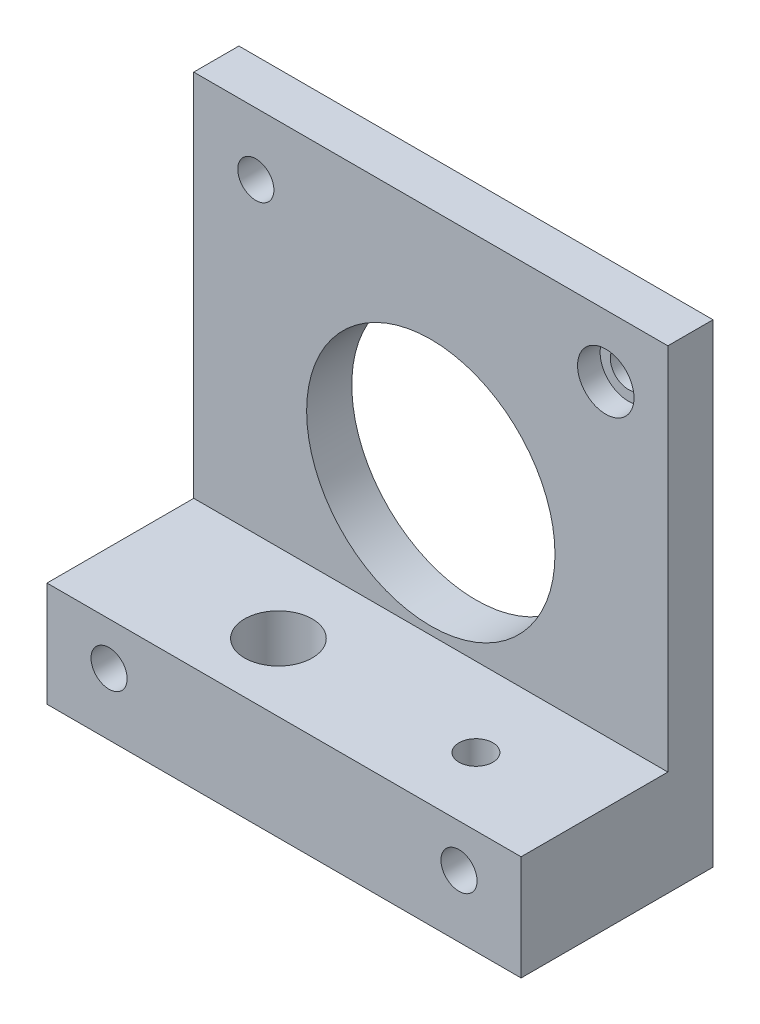
ISO-10303-21;
HEADER;
FILE_DESCRIPTION(('STEP AP214'),'2;1');
FILE_NAME('part.step','',(''),(''),'','','');
FILE_SCHEMA(('AUTOMOTIVE_DESIGN { 1 0 10303 214 1 1 1 1 }'));
ENDSEC;
DATA;
#1=APPLICATION_CONTEXT('core data for automotive mechanical design processes');
#2=APPLICATION_PROTOCOL_DEFINITION('international standard','automotive_design',2000,#1);
#3=PRODUCT_CONTEXT('',#1,'mechanical');
#4=PRODUCT('Part','Part','',(#3));
#5=PRODUCT_RELATED_PRODUCT_CATEGORY('part','',(#4));
#6=PRODUCT_DEFINITION_FORMATION('','',#4);
#7=PRODUCT_DEFINITION_CONTEXT('part definition',#1,'design');
#8=PRODUCT_DEFINITION('design','',#6,#7);
#9=PRODUCT_DEFINITION_SHAPE('','',#8);
#10=(LENGTH_UNIT() NAMED_UNIT(*) SI_UNIT(.MILLI.,.METRE.));
#11=(NAMED_UNIT(*) PLANE_ANGLE_UNIT() SI_UNIT($,.RADIAN.));
#12=(NAMED_UNIT(*) SI_UNIT($,.STERADIAN.) SOLID_ANGLE_UNIT());
#13=UNCERTAINTY_MEASURE_WITH_UNIT(LENGTH_MEASURE(1.E-05),#10,'distance_accuracy_value','');
#14=(GEOMETRIC_REPRESENTATION_CONTEXT(3) GLOBAL_UNCERTAINTY_ASSIGNED_CONTEXT((#13)) GLOBAL_UNIT_ASSIGNED_CONTEXT((#10,
#11,#12)) REPRESENTATION_CONTEXT('',''));
#15=CARTESIAN_POINT('',(0.,0.,0.));
#16=DIRECTION('',(0.,0.,1.));
#17=DIRECTION('',(1.,0.,0.));
#18=AXIS2_PLACEMENT_3D('',#15,#16,#17);
#19=CARTESIAN_POINT('',(36.5,36.5,0.));
#20=DIRECTION('',(0.,0.,1.));
#21=DIRECTION('',(1.,0.,0.));
#22=AXIS2_PLACEMENT_3D('',#19,#20,#21);
#23=CYLINDRICAL_SURFACE('',#22,1.6);
#24=CARTESIAN_POINT('',(36.5,36.5,0.));
#25=DIRECTION('',(0.,0.,1.));
#26=DIRECTION('',(1.,0.,0.));
#27=AXIS2_PLACEMENT_3D('',#24,#25,#26);
#28=CIRCLE('',#27,1.6);
#29=CARTESIAN_POINT('',(38.1,36.5,0.));
#30=VERTEX_POINT('',#29);
#31=EDGE_CURVE('E183',#30,#30,#28,.T.);
#32=ORIENTED_EDGE('',*,*,#31,.F.);
#33=EDGE_LOOP('',(#32));
#34=FACE_BOUND('',#33,.T.);
#35=CARTESIAN_POINT('',(36.5,36.5,2.));
#36=DIRECTION('',(0.,0.,1.));
#37=DIRECTION('',(1.,0.,0.));
#38=AXIS2_PLACEMENT_3D('',#35,#36,#37);
#39=CIRCLE('',#38,1.6);
#40=CARTESIAN_POINT('',(38.1,36.5,2.));
#41=VERTEX_POINT('',#40);
#42=EDGE_CURVE('E47',#41,#41,#39,.F.);
#43=ORIENTED_EDGE('',*,*,#42,.F.);
#44=EDGE_LOOP('',(#43));
#45=FACE_BOUND('',#44,.T.);
#46=ADVANCED_FACE('F43',(#34,#45),#23,.F.);
#47=CARTESIAN_POINT('',(0.,0.,17.));
#48=DIRECTION('',(1.,0.,0.));
#49=DIRECTION('',(0.,0.,-1.));
#50=AXIS2_PLACEMENT_3D('',#47,#48,#49);
#51=PLANE('',#50);
#52=DIRECTION('',(0.,0.,1.));
#53=VECTOR('',#52,1.);
#54=CARTESIAN_POINT('',(0.,9.3,17.));
#55=LINE('',#54,#53);
#56=CARTESIAN_POINT('',(0.,9.3,4.));
#57=VERTEX_POINT('',#56);
#58=CARTESIAN_POINT('',(0.,9.3,17.));
#59=VERTEX_POINT('',#58);
#60=EDGE_CURVE('E61',#57,#59,#55,.T.);
#61=ORIENTED_EDGE('',*,*,#60,.F.);
#62=DIRECTION('',(0.,1.,0.));
#63=VECTOR('',#62,1.);
#64=CARTESIAN_POINT('',(0.,9.3,4.));
#65=LINE('',#64,#63);
#66=CARTESIAN_POINT('',(0.,42.,4.));
#67=VERTEX_POINT('',#66);
#68=EDGE_CURVE('E97',#57,#67,#65,.T.);
#69=ORIENTED_EDGE('',*,*,#68,.T.);
#70=DIRECTION('',(0.,0.,-1.));
#71=VECTOR('',#70,1.);
#72=CARTESIAN_POINT('',(0.,42.,17.));
#73=LINE('',#72,#71);
#74=CARTESIAN_POINT('',(0.,42.,0.));
#75=VERTEX_POINT('',#74);
#76=EDGE_CURVE('E90',#67,#75,#73,.T.);
#77=ORIENTED_EDGE('',*,*,#76,.T.);
#78=DIRECTION('',(0.,-1.,0.));
#79=VECTOR('',#78,1.);
#80=CARTESIAN_POINT('',(0.,0.,0.));
#81=LINE('',#80,#79);
#82=CARTESIAN_POINT('',(0.,0.,0.));
#83=VERTEX_POINT('',#82);
#84=EDGE_CURVE('E94',#75,#83,#81,.T.);
#85=ORIENTED_EDGE('',*,*,#84,.T.);
#86=DIRECTION('',(0.,0.,-1.));
#87=VECTOR('',#86,1.);
#88=CARTESIAN_POINT('',(0.,0.,17.));
#89=LINE('',#88,#87);
#90=CARTESIAN_POINT('',(0.,0.,17.));
#91=VERTEX_POINT('',#90);
#92=EDGE_CURVE('E11',#91,#83,#89,.T.);
#93=ORIENTED_EDGE('',*,*,#92,.F.);
#94=DIRECTION('',(0.,-1.,0.));
#95=VECTOR('',#94,1.);
#96=CARTESIAN_POINT('',(0.,0.,17.));
#97=LINE('',#96,#95);
#98=EDGE_CURVE('E112',#59,#91,#97,.T.);
#99=ORIENTED_EDGE('',*,*,#98,.F.);
#100=EDGE_LOOP('',(#61,#69,#77,#85,#93,#99));
#101=FACE_BOUND('',#100,.T.);
#102=ADVANCED_FACE('F45',(#101),#51,.F.);
#103=CARTESIAN_POINT('',(0.,0.,17.));
#104=DIRECTION('',(0.,1.,0.));
#105=DIRECTION('',(0.,0.,1.));
#106=AXIS2_PLACEMENT_3D('',#103,#104,#105);
#107=PLANE('',#106);
#108=CARTESIAN_POINT('',(32.,0.,11.));
#109=DIRECTION('',(0.,1.,0.));
#110=DIRECTION('',(0.,0.,1.));
#111=AXIS2_PLACEMENT_3D('',#108,#109,#110);
#112=CIRCLE('',#111,1.5);
#113=CARTESIAN_POINT('',(32.,0.,12.5));
#114=VERTEX_POINT('',#113);
#115=EDGE_CURVE('E211',#114,#114,#112,.T.);
#116=ORIENTED_EDGE('',*,*,#115,.T.);
#117=EDGE_LOOP('',(#116));
#118=FACE_BOUND('',#117,.T.);
#119=CARTESIAN_POINT('',(14.5,0.,11.));
#120=DIRECTION('',(0.,1.,0.));
#121=DIRECTION('',(0.,0.,1.));
#122=AXIS2_PLACEMENT_3D('',#119,#120,#121);
#123=CIRCLE('',#122,3.);
#124=CARTESIAN_POINT('',(14.5,0.,14.));
#125=VERTEX_POINT('',#124);
#126=EDGE_CURVE('E215',#125,#125,#123,.T.);
#127=ORIENTED_EDGE('',*,*,#126,.T.);
#128=EDGE_LOOP('',(#127));
#129=FACE_BOUND('',#128,.T.);
#130=DIRECTION('',(1.,0.,0.));
#131=VECTOR('',#130,1.);
#132=CARTESIAN_POINT('',(0.,0.,0.));
#133=LINE('',#132,#131);
#134=CARTESIAN_POINT('',(42.,0.,0.));
#135=VERTEX_POINT('',#134);
#136=EDGE_CURVE('E116',#83,#135,#133,.T.);
#137=ORIENTED_EDGE('',*,*,#136,.T.);
#138=DIRECTION('',(0.,0.,-1.));
#139=VECTOR('',#138,1.);
#140=CARTESIAN_POINT('',(42.,0.,17.));
#141=LINE('',#140,#139);
#142=CARTESIAN_POINT('',(42.,0.,17.));
#143=VERTEX_POINT('',#142);
#144=EDGE_CURVE('E53',#143,#135,#141,.T.);
#145=ORIENTED_EDGE('',*,*,#144,.F.);
#146=DIRECTION('',(1.,0.,0.));
#147=VECTOR('',#146,1.);
#148=CARTESIAN_POINT('',(0.,0.,17.));
#149=LINE('',#148,#147);
#150=EDGE_CURVE('E70',#91,#143,#149,.T.);
#151=ORIENTED_EDGE('',*,*,#150,.F.);
#152=ORIENTED_EDGE('',*,*,#92,.T.);
#153=EDGE_LOOP('',(#137,#145,#151,#152));
#154=FACE_BOUND('',#153,.T.);
#155=ADVANCED_FACE('F231',(#118,#129,#154),#107,.F.);
#156=CARTESIAN_POINT('',(42.,0.,17.));
#157=DIRECTION('',(-1.,0.,0.));
#158=DIRECTION('',(0.,0.,1.));
#159=AXIS2_PLACEMENT_3D('',#156,#157,#158);
#160=PLANE('',#159);
#161=DIRECTION('',(0.,0.,-1.));
#162=VECTOR('',#161,1.);
#163=CARTESIAN_POINT('',(42.,42.,17.));
#164=LINE('',#163,#162);
#165=CARTESIAN_POINT('',(42.,42.,4.));
#166=VERTEX_POINT('',#165);
#167=CARTESIAN_POINT('',(42.,42.,0.));
#168=VERTEX_POINT('',#167);
#169=EDGE_CURVE('E101',#166,#168,#164,.T.);
#170=ORIENTED_EDGE('',*,*,#169,.F.);
#171=DIRECTION('',(0.,1.,0.));
#172=VECTOR('',#171,1.);
#173=CARTESIAN_POINT('',(42.,9.3,4.));
#174=LINE('',#173,#172);
#175=CARTESIAN_POINT('',(42.,9.3,4.));
#176=VERTEX_POINT('',#175);
#177=EDGE_CURVE('E122',#176,#166,#174,.T.);
#178=ORIENTED_EDGE('',*,*,#177,.F.);
#179=DIRECTION('',(0.,0.,-1.));
#180=VECTOR('',#179,1.);
#181=CARTESIAN_POINT('',(42.,9.3,17.));
#182=LINE('',#181,#180);
#183=CARTESIAN_POINT('',(42.,9.3,17.));
#184=VERTEX_POINT('',#183);
#185=EDGE_CURVE('E172',#184,#176,#182,.T.);
#186=ORIENTED_EDGE('',*,*,#185,.F.);
#187=DIRECTION('',(0.,1.,0.));
#188=VECTOR('',#187,1.);
#189=CARTESIAN_POINT('',(42.,0.,17.));
#190=LINE('',#189,#188);
#191=EDGE_CURVE('E102',#143,#184,#190,.T.);
#192=ORIENTED_EDGE('',*,*,#191,.F.);
#193=ORIENTED_EDGE('',*,*,#144,.T.);
#194=DIRECTION('',(0.,1.,0.));
#195=VECTOR('',#194,1.);
#196=CARTESIAN_POINT('',(42.,0.,0.));
#197=LINE('',#196,#195);
#198=EDGE_CURVE('E113',#135,#168,#197,.T.);
#199=ORIENTED_EDGE('',*,*,#198,.T.);
#200=EDGE_LOOP('',(#170,#178,#186,#192,#193,#199));
#201=FACE_BOUND('',#200,.T.);
#202=ADVANCED_FACE('F169',(#201),#160,.F.);
#203=CARTESIAN_POINT('',(0.,42.,17.));
#204=DIRECTION('',(0.,-1.,0.));
#205=DIRECTION('',(0.,0.,-1.));
#206=AXIS2_PLACEMENT_3D('',#203,#204,#205);
#207=PLANE('',#206);
#208=ORIENTED_EDGE('',*,*,#76,.F.);
#209=DIRECTION('',(-1.,0.,0.));
#210=VECTOR('',#209,1.);
#211=CARTESIAN_POINT('',(0.,42.,4.));
#212=LINE('',#211,#210);
#213=EDGE_CURVE('E141',#166,#67,#212,.T.);
#214=ORIENTED_EDGE('',*,*,#213,.F.);
#215=ORIENTED_EDGE('',*,*,#169,.T.);
#216=DIRECTION('',(-1.,0.,0.));
#217=VECTOR('',#216,1.);
#218=CARTESIAN_POINT('',(0.,42.,0.));
#219=LINE('',#218,#217);
#220=EDGE_CURVE('E105',#168,#75,#219,.T.);
#221=ORIENTED_EDGE('',*,*,#220,.T.);
#222=EDGE_LOOP('',(#208,#214,#215,#221));
#223=FACE_BOUND('',#222,.T.);
#224=ADVANCED_FACE('F106',(#223),#207,.F.);
#225=CARTESIAN_POINT('',(0.,0.,17.));
#226=DIRECTION('',(0.,0.,-1.));
#227=DIRECTION('',(-1.,0.,0.));
#228=AXIS2_PLACEMENT_3D('',#225,#226,#227);
#229=PLANE('',#228);
#230=CARTESIAN_POINT('',(36.5,5.5,17.));
#231=DIRECTION('',(0.,0.,1.));
#232=DIRECTION('',(1.,0.,0.));
#233=AXIS2_PLACEMENT_3D('',#230,#231,#232);
#234=CIRCLE('',#233,1.6);
#235=CARTESIAN_POINT('',(38.1,5.5,17.));
#236=VERTEX_POINT('',#235);
#237=EDGE_CURVE('E188',#236,#236,#234,.T.);
#238=ORIENTED_EDGE('',*,*,#237,.F.);
#239=EDGE_LOOP('',(#238));
#240=FACE_BOUND('',#239,.T.);
#241=CARTESIAN_POINT('',(5.5,5.5,17.));
#242=DIRECTION('',(0.,0.,1.));
#243=DIRECTION('',(1.,0.,0.));
#244=AXIS2_PLACEMENT_3D('',#241,#242,#243);
#245=CIRCLE('',#244,1.6);
#246=CARTESIAN_POINT('',(7.1,5.5,17.));
#247=VERTEX_POINT('',#246);
#248=EDGE_CURVE('E196',#247,#247,#245,.T.);
#249=ORIENTED_EDGE('',*,*,#248,.F.);
#250=EDGE_LOOP('',(#249));
#251=FACE_BOUND('',#250,.T.);
#252=ORIENTED_EDGE('',*,*,#191,.T.);
#253=DIRECTION('',(1.,0.,0.));
#254=VECTOR('',#253,1.);
#255=CARTESIAN_POINT('',(0.,9.3,17.));
#256=LINE('',#255,#254);
#257=EDGE_CURVE('E150',#59,#184,#256,.T.);
#258=ORIENTED_EDGE('',*,*,#257,.F.);
#259=ORIENTED_EDGE('',*,*,#98,.T.);
#260=ORIENTED_EDGE('',*,*,#150,.T.);
#261=EDGE_LOOP('',(#252,#258,#259,#260));
#262=FACE_BOUND('',#261,.T.);
#263=ADVANCED_FACE('F163',(#240,#251,#262),#229,.F.);
#264=CARTESIAN_POINT('',(0.,0.,0.));
#265=DIRECTION('',(0.,0.,-1.));
#266=DIRECTION('',(-1.,0.,0.));
#267=AXIS2_PLACEMENT_3D('',#264,#265,#266);
#268=PLANE('',#267);
#269=ORIENTED_EDGE('',*,*,#31,.T.);
#270=EDGE_LOOP('',(#269));
#271=FACE_BOUND('',#270,.T.);
#272=CARTESIAN_POINT('',(36.5,5.5,0.));
#273=DIRECTION('',(0.,0.,1.));
#274=DIRECTION('',(1.,0.,0.));
#275=AXIS2_PLACEMENT_3D('',#272,#273,#274);
#276=CIRCLE('',#275,1.6);
#277=CARTESIAN_POINT('',(38.1,5.5,0.));
#278=VERTEX_POINT('',#277);
#279=EDGE_CURVE('E187',#278,#278,#276,.T.);
#280=ORIENTED_EDGE('',*,*,#279,.T.);
#281=EDGE_LOOP('',(#280));
#282=FACE_BOUND('',#281,.T.);
#283=CARTESIAN_POINT('',(5.5,5.5,0.));
#284=DIRECTION('',(0.,0.,1.));
#285=DIRECTION('',(1.,0.,0.));
#286=AXIS2_PLACEMENT_3D('',#283,#284,#285);
#287=CIRCLE('',#286,1.6);
#288=CARTESIAN_POINT('',(7.1,5.5,0.));
#289=VERTEX_POINT('',#288);
#290=EDGE_CURVE('E192',#289,#289,#287,.T.);
#291=ORIENTED_EDGE('',*,*,#290,.T.);
#292=EDGE_LOOP('',(#291));
#293=FACE_BOUND('',#292,.T.);
#294=CARTESIAN_POINT('',(21.,21.,0.));
#295=DIRECTION('',(0.,0.,1.));
#296=DIRECTION('',(1.,0.,0.));
#297=AXIS2_PLACEMENT_3D('',#294,#295,#296);
#298=CIRCLE('',#297,11.);
#299=CARTESIAN_POINT('',(32.,21.,0.));
#300=VERTEX_POINT('',#299);
#301=EDGE_CURVE('E182',#300,#300,#298,.T.);
#302=ORIENTED_EDGE('',*,*,#301,.T.);
#303=EDGE_LOOP('',(#302));
#304=FACE_BOUND('',#303,.T.);
#305=CARTESIAN_POINT('',(5.5,36.5,0.));
#306=DIRECTION('',(0.,0.,1.));
#307=DIRECTION('',(1.,0.,0.));
#308=AXIS2_PLACEMENT_3D('',#305,#306,#307);
#309=CIRCLE('',#308,1.6);
#310=CARTESIAN_POINT('',(7.1,36.5,0.));
#311=VERTEX_POINT('',#310);
#312=EDGE_CURVE('E138',#311,#311,#309,.T.);
#313=ORIENTED_EDGE('',*,*,#312,.T.);
#314=EDGE_LOOP('',(#313));
#315=FACE_BOUND('',#314,.T.);
#316=ORIENTED_EDGE('',*,*,#84,.F.);
#317=ORIENTED_EDGE('',*,*,#220,.F.);
#318=ORIENTED_EDGE('',*,*,#198,.F.);
#319=ORIENTED_EDGE('',*,*,#136,.F.);
#320=EDGE_LOOP('',(#316,#317,#318,#319));
#321=FACE_BOUND('',#320,.T.);
#322=ADVANCED_FACE('F115',(#271,#282,#293,#304,#315,#321),#268,.T.);
#323=CARTESIAN_POINT('',(0.,9.3,4.));
#324=DIRECTION('',(0.,0.,-1.));
#325=DIRECTION('',(-1.,0.,0.));
#326=AXIS2_PLACEMENT_3D('',#323,#324,#325);
#327=PLANE('',#326);
#328=CARTESIAN_POINT('',(36.5,36.5,4.));
#329=DIRECTION('',(0.,0.,1.));
#330=DIRECTION('',(1.,0.,0.));
#331=AXIS2_PLACEMENT_3D('',#328,#329,#330);
#332=CIRCLE('',#331,2.5);
#333=CARTESIAN_POINT('',(39.,36.5,4.));
#334=VERTEX_POINT('',#333);
#335=EDGE_CURVE('E206',#334,#334,#332,.T.);
#336=ORIENTED_EDGE('',*,*,#335,.F.);
#337=EDGE_LOOP('',(#336));
#338=FACE_BOUND('',#337,.T.);
#339=CARTESIAN_POINT('',(21.,21.,4.));
#340=DIRECTION('',(0.,0.,-1.));
#341=DIRECTION('',(-1.,0.,0.));
#342=AXIS2_PLACEMENT_3D('',#339,#340,#341);
#343=CIRCLE('',#342,11.);
#344=CARTESIAN_POINT('',(10.,21.,4.));
#345=VERTEX_POINT('',#344);
#346=EDGE_CURVE('E137',#345,#345,#343,.T.);
#347=ORIENTED_EDGE('',*,*,#346,.T.);
#348=EDGE_LOOP('',(#347));
#349=FACE_BOUND('',#348,.T.);
#350=CARTESIAN_POINT('',(5.5,36.5,4.));
#351=DIRECTION('',(0.,0.,-1.));
#352=DIRECTION('',(-1.,0.,0.));
#353=AXIS2_PLACEMENT_3D('',#350,#351,#352);
#354=CIRCLE('',#353,1.6);
#355=CARTESIAN_POINT('',(3.9,36.5,4.));
#356=VERTEX_POINT('',#355);
#357=EDGE_CURVE('E134',#356,#356,#354,.T.);
#358=ORIENTED_EDGE('',*,*,#357,.T.);
#359=EDGE_LOOP('',(#358));
#360=FACE_BOUND('',#359,.T.);
#361=ORIENTED_EDGE('',*,*,#213,.T.);
#362=ORIENTED_EDGE('',*,*,#68,.F.);
#363=DIRECTION('',(-1.,0.,0.));
#364=VECTOR('',#363,1.);
#365=CARTESIAN_POINT('',(0.,9.3,4.));
#366=LINE('',#365,#364);
#367=EDGE_CURVE('E153',#176,#57,#366,.T.);
#368=ORIENTED_EDGE('',*,*,#367,.F.);
#369=ORIENTED_EDGE('',*,*,#177,.T.);
#370=EDGE_LOOP('',(#361,#362,#368,#369));
#371=FACE_BOUND('',#370,.T.);
#372=ADVANCED_FACE('F245',(#338,#349,#360,#371),#327,.F.);
#373=CARTESIAN_POINT('',(0.,9.3,0.));
#374=DIRECTION('',(0.,-1.,0.));
#375=DIRECTION('',(0.,0.,-1.));
#376=AXIS2_PLACEMENT_3D('',#373,#374,#375);
#377=PLANE('',#376);
#378=CARTESIAN_POINT('',(32.,9.3,11.));
#379=DIRECTION('',(0.,1.,0.));
#380=DIRECTION('',(0.,0.,1.));
#381=AXIS2_PLACEMENT_3D('',#378,#379,#380);
#382=CIRCLE('',#381,1.5);
#383=CARTESIAN_POINT('',(32.,9.3,12.5));
#384=VERTEX_POINT('',#383);
#385=EDGE_CURVE('E223',#384,#384,#382,.T.);
#386=ORIENTED_EDGE('',*,*,#385,.F.);
#387=EDGE_LOOP('',(#386));
#388=FACE_BOUND('',#387,.T.);
#389=CARTESIAN_POINT('',(14.5,9.3,11.));
#390=DIRECTION('',(0.,1.,0.));
#391=DIRECTION('',(0.,0.,1.));
#392=AXIS2_PLACEMENT_3D('',#389,#390,#391);
#393=CIRCLE('',#392,3.);
#394=CARTESIAN_POINT('',(14.5,9.3,14.));
#395=VERTEX_POINT('',#394);
#396=EDGE_CURVE('E219',#395,#395,#393,.T.);
#397=ORIENTED_EDGE('',*,*,#396,.F.);
#398=EDGE_LOOP('',(#397));
#399=FACE_BOUND('',#398,.T.);
#400=ORIENTED_EDGE('',*,*,#60,.T.);
#401=ORIENTED_EDGE('',*,*,#257,.T.);
#402=ORIENTED_EDGE('',*,*,#185,.T.);
#403=ORIENTED_EDGE('',*,*,#367,.T.);
#404=EDGE_LOOP('',(#400,#401,#402,#403));
#405=FACE_BOUND('',#404,.T.);
#406=ADVANCED_FACE('F241',(#388,#399,#405),#377,.F.);
#407=CARTESIAN_POINT('',(5.5,36.5,0.));
#408=DIRECTION('',(0.,0.,1.));
#409=DIRECTION('',(1.,0.,0.));
#410=AXIS2_PLACEMENT_3D('',#407,#408,#409);
#411=CYLINDRICAL_SURFACE('',#410,1.6);
#412=ORIENTED_EDGE('',*,*,#312,.F.);
#413=EDGE_LOOP('',(#412));
#414=FACE_BOUND('',#413,.T.);
#415=ORIENTED_EDGE('',*,*,#357,.F.);
#416=EDGE_LOOP('',(#415));
#417=FACE_BOUND('',#416,.T.);
#418=ADVANCED_FACE('F244',(#414,#417),#411,.F.);
#419=CARTESIAN_POINT('',(21.,21.,0.));
#420=DIRECTION('',(0.,0.,1.));
#421=DIRECTION('',(1.,0.,0.));
#422=AXIS2_PLACEMENT_3D('',#419,#420,#421);
#423=CYLINDRICAL_SURFACE('',#422,11.);
#424=ORIENTED_EDGE('',*,*,#301,.F.);
#425=EDGE_LOOP('',(#424));
#426=FACE_BOUND('',#425,.T.);
#427=ORIENTED_EDGE('',*,*,#346,.F.);
#428=EDGE_LOOP('',(#427));
#429=FACE_BOUND('',#428,.T.);
#430=ADVANCED_FACE('F274',(#426,#429),#423,.F.);
#431=CARTESIAN_POINT('',(5.5,5.5,0.));
#432=DIRECTION('',(0.,0.,1.));
#433=DIRECTION('',(1.,0.,0.));
#434=AXIS2_PLACEMENT_3D('',#431,#432,#433);
#435=CYLINDRICAL_SURFACE('',#434,1.6);
#436=ORIENTED_EDGE('',*,*,#290,.F.);
#437=EDGE_LOOP('',(#436));
#438=FACE_BOUND('',#437,.T.);
#439=ORIENTED_EDGE('',*,*,#248,.T.);
#440=EDGE_LOOP('',(#439));
#441=FACE_BOUND('',#440,.T.);
#442=ADVANCED_FACE('F330',(#438,#441),#435,.F.);
#443=CARTESIAN_POINT('',(36.5,5.5,0.));
#444=DIRECTION('',(0.,0.,1.));
#445=DIRECTION('',(1.,0.,0.));
#446=AXIS2_PLACEMENT_3D('',#443,#444,#445);
#447=CYLINDRICAL_SURFACE('',#446,1.6);
#448=ORIENTED_EDGE('',*,*,#279,.F.);
#449=EDGE_LOOP('',(#448));
#450=FACE_BOUND('',#449,.T.);
#451=ORIENTED_EDGE('',*,*,#237,.T.);
#452=EDGE_LOOP('',(#451));
#453=FACE_BOUND('',#452,.T.);
#454=ADVANCED_FACE('F271',(#450,#453),#447,.F.);
#455=CARTESIAN_POINT('',(36.5,36.5,2.));
#456=DIRECTION('',(0.,0.,1.));
#457=DIRECTION('',(1.,0.,0.));
#458=AXIS2_PLACEMENT_3D('',#455,#456,#457);
#459=PLANE('',#458);
#460=CARTESIAN_POINT('',(36.5,36.5,2.));
#461=DIRECTION('',(0.,0.,1.));
#462=DIRECTION('',(1.,0.,0.));
#463=AXIS2_PLACEMENT_3D('',#460,#461,#462);
#464=CIRCLE('',#463,2.5);
#465=CARTESIAN_POINT('',(39.,36.5,2.));
#466=VERTEX_POINT('',#465);
#467=EDGE_CURVE('E210',#466,#466,#464,.T.);
#468=ORIENTED_EDGE('',*,*,#467,.T.);
#469=EDGE_LOOP('',(#468));
#470=FACE_BOUND('',#469,.T.);
#471=ORIENTED_EDGE('',*,*,#42,.T.);
#472=EDGE_LOOP('',(#471));
#473=FACE_BOUND('',#472,.T.);
#474=ADVANCED_FACE('F256',(#470,#473),#459,.T.);
#475=CARTESIAN_POINT('',(36.5,36.5,2.));
#476=DIRECTION('',(0.,0.,1.));
#477=DIRECTION('',(1.,0.,0.));
#478=AXIS2_PLACEMENT_3D('',#475,#476,#477);
#479=CYLINDRICAL_SURFACE('',#478,2.5);
#480=ORIENTED_EDGE('',*,*,#467,.F.);
#481=EDGE_LOOP('',(#480));
#482=FACE_BOUND('',#481,.T.);
#483=ORIENTED_EDGE('',*,*,#335,.T.);
#484=EDGE_LOOP('',(#483));
#485=FACE_BOUND('',#484,.T.);
#486=ADVANCED_FACE('F250',(#482,#485),#479,.F.);
#487=CARTESIAN_POINT('',(14.5,0.,11.));
#488=DIRECTION('',(0.,1.,0.));
#489=DIRECTION('',(0.,0.,1.));
#490=AXIS2_PLACEMENT_3D('',#487,#488,#489);
#491=CYLINDRICAL_SURFACE('',#490,3.);
#492=ORIENTED_EDGE('',*,*,#126,.F.);
#493=EDGE_LOOP('',(#492));
#494=FACE_BOUND('',#493,.T.);
#495=ORIENTED_EDGE('',*,*,#396,.T.);
#496=EDGE_LOOP('',(#495));
#497=FACE_BOUND('',#496,.T.);
#498=ADVANCED_FACE('F237',(#494,#497),#491,.F.);
#499=CARTESIAN_POINT('',(32.,0.,11.));
#500=DIRECTION('',(0.,1.,0.));
#501=DIRECTION('',(0.,0.,1.));
#502=AXIS2_PLACEMENT_3D('',#499,#500,#501);
#503=CYLINDRICAL_SURFACE('',#502,1.5);
#504=ORIENTED_EDGE('',*,*,#115,.F.);
#505=EDGE_LOOP('',(#504));
#506=FACE_BOUND('',#505,.T.);
#507=ORIENTED_EDGE('',*,*,#385,.T.);
#508=EDGE_LOOP('',(#507));
#509=FACE_BOUND('',#508,.T.);
#510=ADVANCED_FACE('F234',(#506,#509),#503,.F.);
#511=CLOSED_SHELL('',(#46,#102,#155,#202,#224,#263,#322,#372,#406,#418,#430,#442,#454,#474,#486,
#498,#510));
#512=MANIFOLD_SOLID_BREP('B2',#511);
#513=ADVANCED_BREP_SHAPE_REPRESENTATION('',(#18,#512),#14);
#514=SHAPE_DEFINITION_REPRESENTATION(#9,#513);
ENDSEC;
END-ISO-10303-21;
